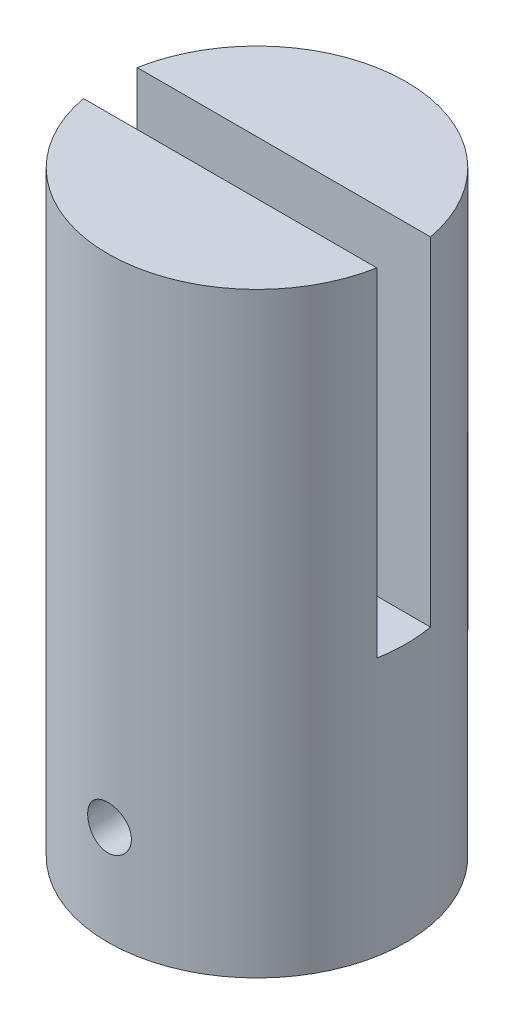
ISO-10303-21;
HEADER;
FILE_DESCRIPTION(('STEP AP214'),'2;1');
FILE_NAME('part.step','',(''),(''),'','','');
FILE_SCHEMA(('AUTOMOTIVE_DESIGN { 1 0 10303 214 1 1 1 1 }'));
ENDSEC;
DATA;
#1=APPLICATION_CONTEXT('core data for automotive mechanical design processes');
#2=APPLICATION_PROTOCOL_DEFINITION('international standard','automotive_design',2000,#1);
#3=PRODUCT_CONTEXT('',#1,'mechanical');
#4=PRODUCT('Part','Part','',(#3));
#5=PRODUCT_RELATED_PRODUCT_CATEGORY('part','',(#4));
#6=PRODUCT_DEFINITION_FORMATION('','',#4);
#7=PRODUCT_DEFINITION_CONTEXT('part definition',#1,'design');
#8=PRODUCT_DEFINITION('design','',#6,#7);
#9=PRODUCT_DEFINITION_SHAPE('','',#8);
#10=(LENGTH_UNIT() NAMED_UNIT(*) SI_UNIT(.MILLI.,.METRE.));
#11=(NAMED_UNIT(*) PLANE_ANGLE_UNIT() SI_UNIT($,.RADIAN.));
#12=(NAMED_UNIT(*) SI_UNIT($,.STERADIAN.) SOLID_ANGLE_UNIT());
#13=UNCERTAINTY_MEASURE_WITH_UNIT(LENGTH_MEASURE(1.E-05),#10,'distance_accuracy_value','');
#14=(GEOMETRIC_REPRESENTATION_CONTEXT(3) GLOBAL_UNCERTAINTY_ASSIGNED_CONTEXT((#13)) GLOBAL_UNIT_ASSIGNED_CONTEXT((#10,
#11,#12)) REPRESENTATION_CONTEXT('',''));
#15=CARTESIAN_POINT('',(0.,0.,0.));
#16=DIRECTION('',(0.,0.,1.));
#17=DIRECTION('',(1.,0.,0.));
#18=AXIS2_PLACEMENT_3D('',#15,#16,#17);
#19=CARTESIAN_POINT('',(0.,20.,0.));
#20=DIRECTION('',(0.,1.,0.));
#21=DIRECTION('',(0.,0.,1.));
#22=AXIS2_PLACEMENT_3D('',#19,#20,#21);
#23=PLANE('',#22);
#24=DIRECTION('',(-1.,0.,0.));
#25=VECTOR('',#24,1.);
#26=CARTESIAN_POINT('',(-7.37749957641476,20.,-1.35));
#27=LINE('',#26,#25);
#28=CARTESIAN_POINT('',(7.37749957641476,20.,-1.35));
#29=VERTEX_POINT('',#28);
#30=CARTESIAN_POINT('',(-7.37749957641476,20.,-1.35));
#31=VERTEX_POINT('',#30);
#32=EDGE_CURVE('E89',#29,#31,#27,.T.);
#33=ORIENTED_EDGE('',*,*,#32,.F.);
#34=CARTESIAN_POINT('',(0.,20.,0.));
#35=DIRECTION('',(0.,1.,0.));
#36=DIRECTION('',(0.,0.,1.));
#37=AXIS2_PLACEMENT_3D('',#34,#35,#36);
#38=CIRCLE('',#37,7.5);
#39=EDGE_CURVE('E138',#29,#31,#38,.T.);
#40=ORIENTED_EDGE('',*,*,#39,.T.);
#41=EDGE_LOOP('',(#33,#40));
#42=FACE_BOUND('',#41,.T.);
#43=ADVANCED_FACE('F45',(#42),#23,.T.);
#44=CARTESIAN_POINT('',(0.,-10.,0.));
#45=DIRECTION('',(0.,1.,0.));
#46=DIRECTION('',(0.,0.,1.));
#47=AXIS2_PLACEMENT_3D('',#44,#45,#46);
#48=CYLINDRICAL_SURFACE('',#47,3.075);
#49=CARTESIAN_POINT('',(0.,-6.1,3.075));
#50=CARTESIAN_POINT('',(0.0597632105915103,-6.10000126903366,3.07500091353291));
#51=CARTESIAN_POINT('',(0.119517399561416,-6.09511406328381,3.07324217731996));
#52=CARTESIAN_POINT('',(0.237250705765298,-6.07576514088002,3.06640085132919));
#53=CARTESIAN_POINT('',(0.295229896797585,-6.06130382285189,3.06131839993701));
#54=CARTESIAN_POINT('',(0.407698813293563,-6.02337630452029,3.04837809209227));
#55=CARTESIAN_POINT('',(0.462194682653862,-5.99992649989657,3.04052529103186));
#56=CARTESIAN_POINT('',(0.566477660621185,-5.94476710352712,3.02283460364577));
#57=CARTESIAN_POINT('',(0.616263632569546,-5.91305552483042,3.01299623992208));
#58=CARTESIAN_POINT('',(0.711663849973043,-5.84097210087029,2.99192770748854));
#59=CARTESIAN_POINT('',(0.757068682669079,-5.80033396928325,2.98066065730164));
#60=CARTESIAN_POINT('',(0.840583811243801,-5.71211652888779,2.95819499936736));
#61=CARTESIAN_POINT('',(0.878692156494227,-5.66453536991841,2.94699641069479));
#62=CARTESIAN_POINT('',(0.947805012054793,-5.56180563468115,2.92551666151353));
#63=CARTESIAN_POINT('',(0.978523865149615,-5.50645473717233,2.91527965187319));
#64=CARTESIAN_POINT('',(1.03012473348824,-5.39094751921219,2.89745041310426));
#65=CARTESIAN_POINT('',(1.05101027668641,-5.33079293128263,2.8898572356875));
#66=CARTESIAN_POINT('',(1.08154234180686,-5.20978565916813,2.878567116895));
#67=CARTESIAN_POINT('',(1.09158563194874,-5.14904628078243,2.87473313669863));
#68=CARTESIAN_POINT('',(1.10138880882361,-5.02663270008343,2.87099250068755));
#69=CARTESIAN_POINT('',(1.1011524661658,-4.96495884883633,2.871084404843));
#70=CARTESIAN_POINT('',(1.09070844073208,-4.84594781087021,2.87506616191202));
#71=CARTESIAN_POINT('',(1.08103664795686,-4.78855553580448,2.87875189613411));
#72=CARTESIAN_POINT('',(1.05287717520453,-4.67626991728994,2.8891690294204));
#73=CARTESIAN_POINT('',(1.03438828710002,-4.62137691742387,2.89590084585542));
#74=CARTESIAN_POINT('',(0.988801578974841,-4.5145028020138,2.91178396169409));
#75=CARTESIAN_POINT('',(0.961556446216323,-4.46259086855437,2.92097617627903));
#76=CARTESIAN_POINT('',(0.899333067466158,-4.36391425742879,2.94072922544267));
#77=CARTESIAN_POINT('',(0.864352328667182,-4.31715124630134,2.95129050074764));
#78=CARTESIAN_POINT('',(0.785146870237094,-4.22711362949867,2.9733747091378));
#79=CARTESIAN_POINT('',(0.740489838311403,-4.18422323085583,2.98491709623557));
#80=CARTESIAN_POINT('',(0.644479395867899,-4.10643180090674,3.00710762164267));
#81=CARTESIAN_POINT('',(0.593125134529764,-4.07153178625896,3.01775564604854));
#82=CARTESIAN_POINT('',(0.484269069333351,-4.01033831169734,3.03713676591382));
#83=CARTESIAN_POINT('',(0.426696323404617,-3.9841620482277,3.04584330297102));
#84=CARTESIAN_POINT('',(0.30757659733637,-3.94199049330725,3.06016548220972));
#85=CARTESIAN_POINT('',(0.246031227987589,-3.92599110362069,3.06578236847285));
#86=CARTESIAN_POINT('',(0.12395506428455,-3.90534116136183,3.07307904523022));
#87=CARTESIAN_POINT('',(0.0635225459169563,-3.90017250218114,3.07493841551141));
#88=CARTESIAN_POINT('',(-0.057367304900624,-3.89983610836605,3.07505850432261));
#89=CARTESIAN_POINT('',(-0.117824630045542,-3.90466638910093,3.07331993698611));
#90=CARTESIAN_POINT('',(-0.234879973270445,-3.92378955550845,3.06655818210888));
#91=CARTESIAN_POINT('',(-0.291539239123175,-3.93775222435941,3.06164969087323));
#92=CARTESIAN_POINT('',(-0.401678725134663,-3.97431845346469,3.04915621793125));
#93=CARTESIAN_POINT('',(-0.455158531401508,-3.99692313587518,3.04157088865021));
#94=CARTESIAN_POINT('',(-0.559110080706005,-4.05083152041721,3.02421524855408));
#95=CARTESIAN_POINT('',(-0.609454162925717,-4.08236293335769,3.01438926476075));
#96=CARTESIAN_POINT('',(-0.704297815473598,-4.15296833260514,2.99365165903803));
#97=CARTESIAN_POINT('',(-0.748795366698148,-4.19204491319558,2.98273966432851));
#98=CARTESIAN_POINT('',(-0.833129001356396,-4.27905847325215,2.96032524331328));
#99=CARTESIAN_POINT('',(-0.872596169193198,-4.32735370318518,2.94882198751349));
#100=CARTESIAN_POINT('',(-0.942927177236782,-4.4301186397681,2.92709283309226));
#101=CARTESIAN_POINT('',(-0.973790587222544,-4.48458865498954,2.9168669983609));
#102=CARTESIAN_POINT('',(-1.02598336827966,-4.59840309672575,2.89892221190103));
#103=CARTESIAN_POINT('',(-1.04730168264201,-4.657753082361,2.89120617024432));
#104=CARTESIAN_POINT('',(-1.07951998703451,-4.77954842780085,2.87933362937367));
#105=CARTESIAN_POINT('',(-1.09042564682632,-4.84199208357357,2.87517519314766));
#106=CARTESIAN_POINT('',(-1.10102820138284,-4.96424603481074,2.87113060305105));
#107=CARTESIAN_POINT('',(-1.10134688325625,-5.02399507849706,2.87100745743974));
#108=CARTESIAN_POINT('',(-1.0923327896614,-5.14264673120247,2.87444896417784));
#109=CARTESIAN_POINT('',(-1.0830007699531,-5.20154940613566,2.87801332775324));
#110=CARTESIAN_POINT('',(-1.05541669369935,-5.31533826321456,2.88823945176782));
#111=CARTESIAN_POINT('',(-1.03739576690336,-5.37028830201472,2.89482074820406));
#112=CARTESIAN_POINT('',(-0.993141438349157,-5.47642219102966,2.91029929004741));
#113=CARTESIAN_POINT('',(-0.966906056978599,-5.52760512972992,2.91919709362548));
#114=CARTESIAN_POINT('',(-0.905476589495095,-5.62746674944541,2.93884740010209));
#115=CARTESIAN_POINT('',(-0.869907463822172,-5.67590094331998,2.94966927402328));
#116=CARTESIAN_POINT('',(-0.791423139928681,-5.7663128501915,2.97168873102052));
#117=CARTESIAN_POINT('',(-0.748505716699851,-5.80828860029058,2.98288642706456));
#118=CARTESIAN_POINT('',(-0.654105696965442,-5.88661231238092,3.00503356644749));
#119=CARTESIAN_POINT('',(-0.602313455460042,-5.92259903481401,3.01594606048935));
#120=CARTESIAN_POINT('',(-0.493040357482252,-5.98533178801608,3.03572313281877));
#121=CARTESIAN_POINT('',(-0.435559904846423,-6.01207847418007,3.04458785633974));
#122=CARTESIAN_POINT('',(-0.316169446179156,-6.05550540038379,3.05929640196948));
#123=CARTESIAN_POINT('',(-0.254237056994954,-6.07213012163186,3.06512353833066));
#124=CARTESIAN_POINT('',(-0.12819907635475,-6.09437457645116,3.07297409935994));
#125=CARTESIAN_POINT('',(-0.0640943498632311,-6.09999863899736,3.07499902026184));
#126=CARTESIAN_POINT('',(0.,-6.1,3.075));
#127=B_SPLINE_CURVE_WITH_KNOTS('',3,(#49,#50,#51,#52,#53,#54,#55,#56,#57,#58,#59,#60,#61,#62,
#63,#64,#65,#66,#67,#68,#69,#70,#71,#72,#73,#74,#75,#76,#77,#78,#79,#80,#81,#82,#83,#84,#85,#86,
#87,#88,#89,#90,#91,#92,#93,#94,#95,#96,#97,#98,#99,#100,#101,#102,#103,#104,#105,#106,#107,
#108,#109,#110,#111,#112,#113,#114,#115,#116,#117,#118,#119,#120,#121,#122,#123,#124,#125,#126),
.UNSPECIFIED.,.T.,.F.,(4,2,2,2,2,2,2,2,2,2,2,2,2,2,2,2,2,2,2,2,2,2,2,2,2,2,2,2,2,2,2,2,2,2,2,2,
2,2,4),(0.,0.179053444377991,0.358099434191551,0.536820372911771,0.715584333636371,
0.900661290192836,1.08578765597631,1.2772097231424,1.4685630602557,1.65264806059341,
1.83666553840804,2.01080592567889,2.18497018070212,2.36223306486509,2.53955315564051,
2.72763972864487,2.91575021960748,3.1062945407004,3.29676208077231,3.47788837373556,
3.65897871945424,3.8338582821191,4.00876056042409,4.1886039094213,4.36850920510472,
4.5578892302861,4.74727872349995,4.93688703495576,5.12639204441126,5.30474619044246,
5.48308637036819,5.6569244278466,5.83080441107637,6.01317878259815,6.19560847365733,
6.38668861626958,6.57775520279875,6.76986056054624,6.96189030584593),.UNSPECIFIED.);
#128=CARTESIAN_POINT('',(0.,-6.1,3.075));
#129=VERTEX_POINT('',#128);
#130=EDGE_CURVE('E126',#129,#129,#127,.T.);
#131=ORIENTED_EDGE('',*,*,#130,.T.);
#132=EDGE_LOOP('',(#131));
#133=FACE_BOUND('',#132,.T.);
#134=CARTESIAN_POINT('',(1.1,-5.,-2.87151963252909));
#135=CARTESIAN_POINT('',(1.10000131770952,-5.05962473591265,-2.87151847603148));
#136=CARTESIAN_POINT('',(1.09513587171653,-5.11924037385219,-2.87339695257202));
#137=CARTESIAN_POINT('',(1.07588126258539,-5.23668743152562,-2.88066114770109));
#138=CARTESIAN_POINT('',(1.06149165475282,-5.29451876781637,-2.88604703005436));
#139=CARTESIAN_POINT('',(1.02377347157126,-5.40667261861835,-2.8996395647741));
#140=CARTESIAN_POINT('',(1.0004646105976,-5.46100256504228,-2.90783999201393));
#141=CARTESIAN_POINT('',(0.945638446192896,-5.56500079435962,-2.92612803084244));
#142=CARTESIAN_POINT('',(0.914118933557319,-5.61466781772006,-2.93621615013819));
#143=CARTESIAN_POINT('',(0.842241837186764,-5.71017277545947,-2.95765344908462));
#144=CARTESIAN_POINT('',(0.801574691309067,-5.75576999241448,-2.9690373869454));
#145=CARTESIAN_POINT('',(0.713215169595768,-5.83966464354244,-2.99149209259413));
#146=CARTESIAN_POINT('',(0.665521465240456,-5.87796069412716,-3.00256280068648));
#147=CARTESIAN_POINT('',(0.562664173505737,-5.94729638437402,-3.02355222150997));
#148=CARTESIAN_POINT('',(0.507316803581348,-5.97807840867971,-3.03342537222178));
#149=CARTESIAN_POINT('',(0.391814508446919,-6.02979680802113,-3.0504930105959));
#150=CARTESIAN_POINT('',(0.331661096752453,-6.05073626848381,-3.05768833754947));
#151=CARTESIAN_POINT('',(0.210782115719207,-6.08134293003399,-3.06834311930066));
#152=CARTESIAN_POINT('',(0.150173530849659,-6.09142367049775,-3.0719392293443));
#153=CARTESIAN_POINT('',(0.0280254221603174,-6.10134743808663,-3.07547853225752));
#154=CARTESIAN_POINT('',(-0.0335138206119407,-6.10119349658941,-3.07542280675266));
#155=CARTESIAN_POINT('',(-0.152828211010988,-6.09090231663337,-3.07175408845823));
#156=CARTESIAN_POINT('',(-0.210647976928136,-6.08121547544147,-3.06830158384997));
#157=CARTESIAN_POINT('',(-0.3237793704866,-6.05288560240764,-3.058433877302));
#158=CARTESIAN_POINT('',(-0.379090822602802,-6.03424194484671,-3.05201846837639));
#159=CARTESIAN_POINT('',(-0.486553864673533,-5.98829605753622,-3.03675480109506));
#160=CARTESIAN_POINT('',(-0.538650177183935,-5.96087591941742,-3.02787364541843));
#161=CARTESIAN_POINT('',(-0.63762647978217,-5.89825646632391,-3.00858833398922));
#162=CARTESIAN_POINT('',(-0.684504870544227,-5.86305477607249,-2.99818371353537));
#163=CARTESIAN_POINT('',(-0.774380644087464,-5.78365795480602,-2.97627517965288));
#164=CARTESIAN_POINT('',(-0.817034562949113,-5.73908146219389,-2.96474223763091));
#165=CARTESIAN_POINT('',(-0.894383288063324,-5.64332547483675,-2.94233393768585));
#166=CARTESIAN_POINT('',(-0.929076449387705,-5.59214461884198,-2.93145871600852));
#167=CARTESIAN_POINT('',(-0.990095217710666,-5.48339308654567,-2.9114241863929));
#168=CARTESIAN_POINT('',(-1.01625323196948,-5.4257212875831,-2.90230054669491));
#169=CARTESIAN_POINT('',(-1.0583617387087,-5.30638029550772,-2.88721348582824));
#170=CARTESIAN_POINT('',(-1.07431730107417,-5.24471310462283,-2.8812484952917));
#171=CARTESIAN_POINT('',(-1.09482203330999,-5.1224993785686,-2.87351777180381));
#172=CARTESIAN_POINT('',(-1.09991145357729,-5.06205609943027,-2.87155338255037));
#173=CARTESIAN_POINT('',(-1.10008619536482,-4.94116033372241,-2.87148678309557));
#174=CARTESIAN_POINT('',(-1.09517370711197,-4.88070785206672,-2.87338372733591));
#175=CARTESIAN_POINT('',(-1.07597222321109,-4.7641423008621,-2.88062582510613));
#176=CARTESIAN_POINT('',(-1.06208221203039,-4.70795335818176,-2.88582409542701));
#177=CARTESIAN_POINT('',(-1.02581193388852,-4.59872273766569,-2.89891427709482));
#178=CARTESIAN_POINT('',(-1.00343002420717,-4.54568167106988,-2.90680670958585));
#179=CARTESIAN_POINT('',(-0.949921615532453,-4.44218124836985,-2.92473837725696));
#180=CARTESIAN_POINT('',(-0.918515276120809,-4.39187827972181,-2.93484334823574));
#181=CARTESIAN_POINT('',(-0.848155327810068,-4.2970629959327,-2.95594394853883));
#182=CARTESIAN_POINT('',(-0.809199178822545,-4.25255263812917,-2.96693987689384));
#183=CARTESIAN_POINT('',(-0.722226212551702,-4.16797045341023,-2.98933765026307));
#184=CARTESIAN_POINT('',(-0.673820739140554,-4.12829370589489,-3.00072713177972));
#185=CARTESIAN_POINT('',(-0.57075763029431,-4.05758813852833,-3.02202345931754));
#186=CARTESIAN_POINT('',(-0.516100095849029,-4.02655917901682,-3.03193032928144));
#187=CARTESIAN_POINT('',(-0.402236510192129,-3.97427649622796,-3.04911875808664));
#188=CARTESIAN_POINT('',(-0.343054986122285,-3.95297389666075,-3.05641340287457));
#189=CARTESIAN_POINT('',(-0.221631678370066,-3.92073144496485,-3.06760725170602));
#190=CARTESIAN_POINT('',(-0.159391199819758,-3.90978721302949,-3.07150789077346));
#191=CARTESIAN_POINT('',(-0.0372049795385518,-3.89901194158228,-3.07534991733188));
#192=CARTESIAN_POINT('',(0.0226852322039303,-3.89861732856655,-3.07549208231335));
#193=CARTESIAN_POINT('',(0.14163978922418,-3.90752823517031,-3.07231218324376));
#194=CARTESIAN_POINT('',(0.200704218830169,-3.9168327568804,-3.06899047557822));
#195=CARTESIAN_POINT('',(0.315105959897884,-3.9444897847861,-3.0593405455396));
#196=CARTESIAN_POINT('',(0.370494945156223,-3.96265224709085,-3.05307556929679));
#197=CARTESIAN_POINT('',(0.47745185103428,-4.00732651373115,-3.03818753718342));
#198=CARTESIAN_POINT('',(0.529019053034509,-4.03383988341319,-3.02956403925667));
#199=CARTESIAN_POINT('',(0.629129975130921,-4.09567990977488,-3.01040243315964));
#200=CARTESIAN_POINT('',(0.677469404553846,-4.13131746547319,-2.99980139384808));
#201=CARTESIAN_POINT('',(0.767660743359063,-4.20988813583839,-2.97799910953856));
#202=CARTESIAN_POINT('',(0.809510422680756,-4.25282374774608,-2.96679765999418));
#203=CARTESIAN_POINT('',(0.887543971684473,-4.34717121489927,-2.94442133989725));
#204=CARTESIAN_POINT('',(0.923370180238827,-4.3988861094655,-2.93327234143168));
#205=CARTESIAN_POINT('',(0.985819487120141,-4.50795570701007,-2.91287979595815));
#206=CARTESIAN_POINT('',(1.01244315852089,-4.56531005851413,-2.903636130313));
#207=CARTESIAN_POINT('',(1.05567935909929,-4.68444375442762,-2.88820030754541));
#208=CARTESIAN_POINT('',(1.07223714115202,-4.74624528830966,-2.88202487076171));
#209=CARTESIAN_POINT('',(1.09439397978158,-4.87203545589418,-2.87368616962434));
#210=CARTESIAN_POINT('',(1.09999858610446,-4.93602296527697,-2.87152087344507));
#211=CARTESIAN_POINT('',(1.1,-5.,-2.87151963252909));
#212=B_SPLINE_CURVE_WITH_KNOTS('',3,(#134,#135,#136,#137,#138,#139,#140,#141,#142,#143,#144,
#145,#146,#147,#148,#149,#150,#151,#152,#153,#154,#155,#156,#157,#158,#159,#160,#161,#162,#163,
#164,#165,#166,#167,#168,#169,#170,#171,#172,#173,#174,#175,#176,#177,#178,#179,#180,#181,#182,
#183,#184,#185,#186,#187,#188,#189,#190,#191,#192,#193,#194,#195,#196,#197,#198,#199,#200,#201,
#202,#203,#204,#205,#206,#207,#208,#209,#210,#211),.UNSPECIFIED.,.T.,.F.,(4,2,2,2,2,2,2,2,2,2,2,
2,2,2,2,2,2,2,2,2,2,2,2,2,2,2,2,2,2,2,2,2,2,2,2,2,2,2,4),(0.,0.178636531943315,
0.357281405226638,0.535533676500885,0.713833958971606,0.899449843639194,1.08510086806723,
1.27642721068814,1.46769353665049,1.65138582892187,1.83502371420413,2.01038251663651,
2.18575357133458,2.36358720391529,2.5414751943917,2.72891319682236,2.91638989468673,
3.10735276198973,3.29822066057895,3.47935381233509,3.66044730365699,3.83399952556349,
4.00758533751092,4.18727563091088,4.36702648532121,4.55697525307953,4.74692095302029,
4.93590135060676,5.1248018062672,5.30358957341811,5.48235894754814,5.65745122757812,
5.83257634755562,6.01472712708489,6.19694036070302,6.38769714709019,6.57844205225207,
6.77021532425795,6.96189140352281),.UNSPECIFIED.);
#213=CARTESIAN_POINT('',(1.1,-5.,-2.87151963252909));
#214=VERTEX_POINT('',#213);
#215=EDGE_CURVE('E169',#214,#214,#212,.T.);
#216=ORIENTED_EDGE('',*,*,#215,.T.);
#217=EDGE_LOOP('',(#216));
#218=FACE_BOUND('',#217,.T.);
#219=CARTESIAN_POINT('',(0.,-10.,0.));
#220=DIRECTION('',(0.,1.,0.));
#221=DIRECTION('',(0.,0.,1.));
#222=AXIS2_PLACEMENT_3D('',#219,#220,#221);
#223=CIRCLE('',#222,3.075);
#224=CARTESIAN_POINT('',(0.,-10.,3.075));
#225=VERTEX_POINT('',#224);
#226=EDGE_CURVE('E139',#225,#225,#223,.T.);
#227=ORIENTED_EDGE('',*,*,#226,.F.);
#228=EDGE_LOOP('',(#227));
#229=FACE_BOUND('',#228,.T.);
#230=CARTESIAN_POINT('',(0.,0.,0.));
#231=DIRECTION('',(0.,1.,0.));
#232=DIRECTION('',(0.,0.,1.));
#233=AXIS2_PLACEMENT_3D('',#230,#231,#232);
#234=CIRCLE('',#233,3.075);
#235=CARTESIAN_POINT('',(0.,0.,3.075));
#236=VERTEX_POINT('',#235);
#237=EDGE_CURVE('E144',#236,#236,#234,.T.);
#238=ORIENTED_EDGE('',*,*,#237,.T.);
#239=EDGE_LOOP('',(#238));
#240=FACE_BOUND('',#239,.T.);
#241=ADVANCED_FACE('F47',(#133,#218,#229,#240),#48,.F.);
#242=CARTESIAN_POINT('',(0.,-10.,0.));
#243=DIRECTION('',(0.,1.,0.));
#244=DIRECTION('',(0.,0.,1.));
#245=AXIS2_PLACEMENT_3D('',#242,#243,#244);
#246=CYLINDRICAL_SURFACE('',#245,7.5);
#247=CARTESIAN_POINT('',(0.,-3.9,-7.5));
#248=CARTESIAN_POINT('',(0.0614339137792254,-3.90000254549349,-7.49999903078676));
#249=CARTESIAN_POINT('',(0.122903869751573,-3.90516390668222,-7.49923725541577));
#250=CARTESIAN_POINT('',(0.244126707027792,-3.92566838042423,-7.49627169143623));
#251=CARTESIAN_POINT('',(0.303877838643947,-3.94102150996431,-7.49406648417941));
#252=CARTESIAN_POINT('',(0.419891057921686,-3.98144182653872,-7.48846196014082));
#253=CARTESIAN_POINT('',(0.476155705499526,-4.00650178600017,-7.48506353199072));
#254=CARTESIAN_POINT('',(0.583672318702268,-4.06560699327752,-7.47744844153889));
#255=CARTESIAN_POINT('',(0.63492500236734,-4.09965095140642,-7.47323189670389));
#256=CARTESIAN_POINT('',(0.731355183041635,-4.17602929289263,-7.46441445772028));
#257=CARTESIAN_POINT('',(0.776489749189182,-4.21841760855832,-7.45981118128225));
#258=CARTESIAN_POINT('',(0.859032180642691,-4.31016538152651,-7.45075782263986));
#259=CARTESIAN_POINT('',(0.8964396091892,-4.35952523261435,-7.4463077491068));
#260=CARTESIAN_POINT('',(0.962632049862312,-4.46410210237275,-7.43804150204043));
#261=CARTESIAN_POINT('',(0.991375704507371,-4.51934556285402,-7.43422840657554));
#262=CARTESIAN_POINT('',(1.03916040032448,-4.6339413056616,-7.4277002412086));
#263=CARTESIAN_POINT('',(1.05820194689178,-4.69329337378228,-7.42498511411349));
#264=CARTESIAN_POINT('',(1.08590896566669,-4.81397080126806,-7.42098364429715));
#265=CARTESIAN_POINT('',(1.09464780616288,-4.87527897467988,-7.41968720355019));
#266=CARTESIAN_POINT('',(1.10172860035277,-4.99850422396054,-7.4186392078154));
#267=CARTESIAN_POINT('',(1.10007112514448,-5.060421266196,-7.41888756796745));
#268=CARTESIAN_POINT('',(1.08646633340055,-5.18258938077591,-7.42089187683157));
#269=CARTESIAN_POINT('',(1.074600601277,-5.24284976276574,-7.42263587207579));
#270=CARTESIAN_POINT('',(1.0410437721177,-5.36051487436565,-7.42741627905539));
#271=CARTESIAN_POINT('',(1.01935240833592,-5.41791952640148,-7.43045272587809));
#272=CARTESIAN_POINT('',(0.9666747959219,-5.52849264509925,-7.43748916017096));
#273=CARTESIAN_POINT('',(0.935653862230755,-5.58164435018106,-7.44149273205095));
#274=CARTESIAN_POINT('',(0.865222397580546,-5.68201885530944,-7.45000970051316));
#275=CARTESIAN_POINT('',(0.825811339856102,-5.72924128279628,-7.45452312909787));
#276=CARTESIAN_POINT('',(0.739269913176589,-5.81688969773502,-7.46360412460752));
#277=CARTESIAN_POINT('',(0.692069374554426,-5.85724642305706,-7.468171796712));
#278=CARTESIAN_POINT('',(0.59152834177619,-5.92947596797951,-7.47680652057131));
#279=CARTESIAN_POINT('',(0.538187822827545,-5.96134875332097,-7.48087357030453));
#280=CARTESIAN_POINT('',(0.426821886355061,-6.01570872231936,-7.48805278591713));
#281=CARTESIAN_POINT('',(0.368793894772149,-6.03819070676104,-7.49116442258036));
#282=CARTESIAN_POINT('',(0.249730300005073,-6.07307143246982,-7.49607774605898));
#283=CARTESIAN_POINT('',(0.18869489140167,-6.08547082517737,-7.49787951750451));
#284=CARTESIAN_POINT('',(0.0659469706202572,-6.09974262923242,-7.49995892171531));
#285=CARTESIAN_POINT('',(0.0042457578093759,-6.10171028893742,-7.50025034437375));
#286=CARTESIAN_POINT('',(-0.118605719627989,-6.09531538208784,-7.49931370926277));
#287=CARTESIAN_POINT('',(-0.179756000485778,-6.08695312087777,-7.4980856964067));
#288=CARTESIAN_POINT('',(-0.299482343134792,-6.06021494109972,-7.49425670440967));
#289=CARTESIAN_POINT('',(-0.358068956985494,-6.0418852853352,-7.49166207005829));
#290=CARTESIAN_POINT('',(-0.471337351522008,-5.99578131532552,-7.4853898820589));
#291=CARTESIAN_POINT('',(-0.526018955716097,-5.96800657452457,-7.48171227950325));
#292=CARTESIAN_POINT('',(-0.630344895974966,-5.90357639841735,-7.47364872669928));
#293=CARTESIAN_POINT('',(-0.679951436879122,-5.86686037164079,-7.4692580146524));
#294=CARTESIAN_POINT('',(-0.772332556824691,-5.78567440913556,-7.46027215892464));
#295=CARTESIAN_POINT('',(-0.815106756906359,-5.74120404359393,-7.45567700392226));
#296=CARTESIAN_POINT('',(-0.89295433674454,-5.64534834716264,-7.44675660483446));
#297=CARTESIAN_POINT('',(-0.927963966645664,-5.59391098267122,-7.44243378980161));
#298=CARTESIAN_POINT('',(-0.988845883817523,-5.48582972563999,-7.43459010616074));
#299=CARTESIAN_POINT('',(-1.01471840934016,-5.42918596890649,-7.43106921664319));
#300=CARTESIAN_POINT('',(-1.05649225011172,-5.31249216275356,-7.42524548075169));
#301=CARTESIAN_POINT('',(-1.07242745544987,-5.25245446070129,-7.42293849873847));
#302=CARTESIAN_POINT('',(-1.09398237497283,-5.13051870640119,-7.41979266689479));
#303=CARTESIAN_POINT('',(-1.09960276755589,-5.06862077677145,-7.41895372051277));
#304=CARTESIAN_POINT('',(-1.10035290779075,-4.94535684661601,-7.41884244449659));
#305=CARTESIAN_POINT('',(-1.0955828767175,-4.88399144592204,-7.4195551483194));
#306=CARTESIAN_POINT('',(-1.07590197796449,-4.76294549188111,-7.42243439260507));
#307=CARTESIAN_POINT('',(-1.06099112373807,-4.70326493629907,-7.42460093113919));
#308=CARTESIAN_POINT('',(-1.02148671040963,-4.58730848428274,-7.43013858440607));
#309=CARTESIAN_POINT('',(-0.996899848024538,-4.53103026411966,-7.43350886588553));
#310=CARTESIAN_POINT('',(-0.938751285001512,-4.42338153240762,-7.44107531977226));
#311=CARTESIAN_POINT('',(-0.905189307493384,-4.37201117232589,-7.44527151765687));
#312=CARTESIAN_POINT('',(-0.829677941083677,-4.27512669624521,-7.45406523526029));
#313=CARTESIAN_POINT('',(-0.787654244466669,-4.22967079186304,-7.45866609131538));
#314=CARTESIAN_POINT('',(-0.696569291934378,-4.14642019159302,-7.46772263777699));
#315=CARTESIAN_POINT('',(-0.647506399685664,-4.10862728199045,-7.47217829413399));
#316=CARTESIAN_POINT('',(-0.543433518566299,-4.0415991568414,-7.4804690354185));
#317=CARTESIAN_POINT('',(-0.488393657059063,-4.012409915266,-7.48430073920828));
#318=CARTESIAN_POINT('',(-0.37416307280373,-3.96373339505319,-7.49087858915199));
#319=CARTESIAN_POINT('',(-0.314976753586265,-3.94423599668696,-7.49362586698822));
#320=CARTESIAN_POINT('',(-0.212932358081482,-3.91995514332138,-7.49709312323017));
#321=CARTESIAN_POINT('',(-0.170706280118833,-3.9124833013654,-7.49817764536712));
#322=CARTESIAN_POINT('',(-0.0856593052075394,-3.90250487105526,-7.4996314175168));
#323=CARTESIAN_POINT('',(-0.0428384151765292,-3.89999822500472,-7.50000067584102));
#324=CARTESIAN_POINT('',(0.,-3.9,-7.5));
#325=B_SPLINE_CURVE_WITH_KNOTS('',3,(#247,#248,#249,#250,#251,#252,#253,#254,#255,#256,#257,
#258,#259,#260,#261,#262,#263,#264,#265,#266,#267,#268,#269,#270,#271,#272,#273,#274,#275,#276,
#277,#278,#279,#280,#281,#282,#283,#284,#285,#286,#287,#288,#289,#290,#291,#292,#293,#294,#295,
#296,#297,#298,#299,#300,#301,#302,#303,#304,#305,#306,#307,#308,#309,#310,#311,#312,#313,#314,
#315,#316,#317,#318,#319,#320,#321,#322,#323,#324),.UNSPECIFIED.,.T.,.F.,(4,2,2,2,2,2,2,2,2,2,2,
2,2,2,2,2,2,2,2,2,2,2,2,2,2,2,2,2,2,2,2,2,2,2,2,2,2,2,4),(0.,0.184145214135645,
0.368471684025478,0.552661169958333,0.736824229163183,0.922219175599117,1.10762459821091,
1.29390154601941,1.48016878943053,1.66510140488703,1.85002386157894,2.03348200306703,
2.21694512537133,2.40109893203312,2.58526430401544,2.77118963521338,2.95711571718387,
3.14314460109183,3.32916146464068,3.51347691345021,3.69778691416735,3.88124866815049,
4.0647187086728,4.24946845023511,4.4342284354933,4.62045340203654,4.80667351236636,
4.99225501652602,5.17782431467818,5.36161162819954,5.54539869789972,5.72905879255057,
5.91272455352131,6.09807966640001,6.28347793700445,6.46984963984061,6.65602633191713,
6.78443392176047,6.91284001947813),.UNSPECIFIED.);
#326=CARTESIAN_POINT('',(0.,-3.9,-7.5));
#327=VERTEX_POINT('',#326);
#328=EDGE_CURVE('E11',#327,#327,#325,.T.);
#329=ORIENTED_EDGE('',*,*,#328,.F.);
#330=EDGE_LOOP('',(#329));
#331=FACE_BOUND('',#330,.T.);
#332=CARTESIAN_POINT('',(0.,-6.1,7.5));
#333=CARTESIAN_POINT('',(0.0614339137792254,-6.09999745450651,7.49999903078676));
#334=CARTESIAN_POINT('',(0.122903869751573,-6.09483609331779,7.49923725541577));
#335=CARTESIAN_POINT('',(0.244126707027792,-6.07433161957577,7.49627169143623));
#336=CARTESIAN_POINT('',(0.303877838643947,-6.05897849003569,7.49406648417941));
#337=CARTESIAN_POINT('',(0.419891057921686,-6.01855817346128,7.48846196014082));
#338=CARTESIAN_POINT('',(0.476155705499526,-5.99349821399983,7.48506353199072));
#339=CARTESIAN_POINT('',(0.583672318702268,-5.93439300672248,7.47744844153889));
#340=CARTESIAN_POINT('',(0.63492500236734,-5.90034904859358,7.47323189670389));
#341=CARTESIAN_POINT('',(0.731355183041635,-5.82397070710737,7.46441445772028));
#342=CARTESIAN_POINT('',(0.776489749189181,-5.78158239144168,7.45981118128225));
#343=CARTESIAN_POINT('',(0.85903218064269,-5.6898346184735,7.45075782263986));
#344=CARTESIAN_POINT('',(0.896439609189199,-5.64047476738565,7.4463077491068));
#345=CARTESIAN_POINT('',(0.962632049862312,-5.53589789762726,7.43804150204043));
#346=CARTESIAN_POINT('',(0.991375704507371,-5.48065443714598,7.43422840657554));
#347=CARTESIAN_POINT('',(1.03916040032448,-5.3660586943384,7.4277002412086));
#348=CARTESIAN_POINT('',(1.05820194689179,-5.30670662621772,7.42498511411349));
#349=CARTESIAN_POINT('',(1.08590896566669,-5.18602919873194,7.42098364429715));
#350=CARTESIAN_POINT('',(1.09464780616288,-5.12472102532012,7.41968720355019));
#351=CARTESIAN_POINT('',(1.10172860035277,-5.00149577603946,7.4186392078154));
#352=CARTESIAN_POINT('',(1.10007112514448,-4.939578733804,7.41888756796745));
#353=CARTESIAN_POINT('',(1.08646633340055,-4.81741061922409,7.42089187683157));
#354=CARTESIAN_POINT('',(1.074600601277,-4.75715023723427,7.42263587207579));
#355=CARTESIAN_POINT('',(1.0410437721177,-4.63948512563435,7.42741627905539));
#356=CARTESIAN_POINT('',(1.01935240833592,-4.58208047359852,7.43045272587809));
#357=CARTESIAN_POINT('',(0.9666747959219,-4.47150735490076,7.43748916017096));
#358=CARTESIAN_POINT('',(0.935653862230755,-4.41835564981894,7.44149273205095));
#359=CARTESIAN_POINT('',(0.865222397580546,-4.31798114469056,7.45000970051316));
#360=CARTESIAN_POINT('',(0.825811339856102,-4.27075871720372,7.45452312909787));
#361=CARTESIAN_POINT('',(0.739269913176589,-4.18311030226498,7.46360412460752));
#362=CARTESIAN_POINT('',(0.692069374554426,-4.14275357694294,7.468171796712));
#363=CARTESIAN_POINT('',(0.591528341776189,-4.07052403202049,7.47680652057131));
#364=CARTESIAN_POINT('',(0.538187822827545,-4.03865124667903,7.48087357030453));
#365=CARTESIAN_POINT('',(0.426821886355061,-3.98429127768064,7.48805278591713));
#366=CARTESIAN_POINT('',(0.368793894772149,-3.96180929323896,7.49116442258036));
#367=CARTESIAN_POINT('',(0.249730300005073,-3.92692856753019,7.49607774605898));
#368=CARTESIAN_POINT('',(0.18869489140167,-3.91452917482264,7.49787951750451));
#369=CARTESIAN_POINT('',(0.0659469706202573,-3.90025737076758,7.49995892171531));
#370=CARTESIAN_POINT('',(0.00424575780937592,-3.89828971106258,7.50025034437375));
#371=CARTESIAN_POINT('',(-0.118605719627989,-3.90468461791216,7.49931370926277));
#372=CARTESIAN_POINT('',(-0.179756000485778,-3.91304687912223,7.4980856964067));
#373=CARTESIAN_POINT('',(-0.299482343134793,-3.93978505890028,7.49425670440967));
#374=CARTESIAN_POINT('',(-0.358068956985494,-3.9581147146648,7.49166207005829));
#375=CARTESIAN_POINT('',(-0.471337351522008,-4.00421868467448,7.4853898820589));
#376=CARTESIAN_POINT('',(-0.526018955716097,-4.03199342547543,7.48171227950325));
#377=CARTESIAN_POINT('',(-0.630344895974966,-4.09642360158265,7.47364872669928));
#378=CARTESIAN_POINT('',(-0.679951436879122,-4.13313962835921,7.4692580146524));
#379=CARTESIAN_POINT('',(-0.772332556824691,-4.21432559086444,7.46027215892464));
#380=CARTESIAN_POINT('',(-0.815106756906359,-4.25879595640607,7.45567700392226));
#381=CARTESIAN_POINT('',(-0.89295433674454,-4.35465165283736,7.44675660483446));
#382=CARTESIAN_POINT('',(-0.927963966645664,-4.40608901732878,7.44243378980161));
#383=CARTESIAN_POINT('',(-0.988845883817523,-4.51417027436001,7.43459010616074));
#384=CARTESIAN_POINT('',(-1.01471840934016,-4.57081403109351,7.43106921664319));
#385=CARTESIAN_POINT('',(-1.05649225011172,-4.68750783724644,7.42524548075169));
#386=CARTESIAN_POINT('',(-1.07242745544987,-4.74754553929871,7.42293849873847));
#387=CARTESIAN_POINT('',(-1.09398237497283,-4.86948129359881,7.41979266689479));
#388=CARTESIAN_POINT('',(-1.09960276755589,-4.93137922322855,7.41895372051277));
#389=CARTESIAN_POINT('',(-1.10035290779075,-5.05464315338399,7.41884244449659));
#390=CARTESIAN_POINT('',(-1.0955828767175,-5.11600855407796,7.4195551483194));
#391=CARTESIAN_POINT('',(-1.07590197796449,-5.23705450811889,7.42243439260507));
#392=CARTESIAN_POINT('',(-1.06099112373807,-5.29673506370093,7.42460093113919));
#393=CARTESIAN_POINT('',(-1.02148671040963,-5.41269151571726,7.43013858440607));
#394=CARTESIAN_POINT('',(-0.996899848024538,-5.46896973588034,7.43350886588553));
#395=CARTESIAN_POINT('',(-0.938751285001512,-5.57661846759238,7.44107531977226));
#396=CARTESIAN_POINT('',(-0.905189307493384,-5.62798882767412,7.44527151765687));
#397=CARTESIAN_POINT('',(-0.829677941083677,-5.7248733037548,7.45406523526029));
#398=CARTESIAN_POINT('',(-0.787654244466668,-5.77032920813697,7.45866609131538));
#399=CARTESIAN_POINT('',(-0.696569291934377,-5.85357980840698,7.46772263777699));
#400=CARTESIAN_POINT('',(-0.647506399685664,-5.89137271800955,7.47217829413399));
#401=CARTESIAN_POINT('',(-0.543433518566299,-5.9584008431586,7.4804690354185));
#402=CARTESIAN_POINT('',(-0.488393657059064,-5.987590084734,7.48430073920828));
#403=CARTESIAN_POINT('',(-0.374163072803731,-6.03626660494681,7.49087858915199));
#404=CARTESIAN_POINT('',(-0.314976753586265,-6.05576400331304,7.49362586698822));
#405=CARTESIAN_POINT('',(-0.212932358081482,-6.08004485667862,7.49709312323017));
#406=CARTESIAN_POINT('',(-0.170706280118833,-6.0875166986346,7.49817764536712));
#407=CARTESIAN_POINT('',(-0.085659305207539,-6.09749512894474,7.4996314175168));
#408=CARTESIAN_POINT('',(-0.042838415176529,-6.10000177499528,7.50000067584102));
#409=CARTESIAN_POINT('',(0.,-6.1,7.5));
#410=B_SPLINE_CURVE_WITH_KNOTS('',3,(#332,#333,#334,#335,#336,#337,#338,#339,#340,#341,#342,
#343,#344,#345,#346,#347,#348,#349,#350,#351,#352,#353,#354,#355,#356,#357,#358,#359,#360,#361,
#362,#363,#364,#365,#366,#367,#368,#369,#370,#371,#372,#373,#374,#375,#376,#377,#378,#379,#380,
#381,#382,#383,#384,#385,#386,#387,#388,#389,#390,#391,#392,#393,#394,#395,#396,#397,#398,#399,
#400,#401,#402,#403,#404,#405,#406,#407,#408,#409),.UNSPECIFIED.,.T.,.F.,(4,2,2,2,2,2,2,2,2,2,2,
2,2,2,2,2,2,2,2,2,2,2,2,2,2,2,2,2,2,2,2,2,2,2,2,2,2,2,4),(0.,0.184145214135645,
0.368471684025478,0.552661169958333,0.736824229163183,0.922219175599117,1.10762459821091,
1.29390154601942,1.48016878943053,1.66510140488703,1.85002386157894,2.03348200306703,
2.21694512537133,2.40109893203312,2.58526430401544,2.77118963521338,2.95711571718387,
3.14314460109183,3.32916146464068,3.51347691345021,3.69778691416735,3.88124866815049,
4.0647187086728,4.24946845023511,4.4342284354933,4.62045340203654,4.80667351236636,
4.99225501652602,5.17782431467818,5.36161162819954,5.54539869789972,5.72905879255057,
5.91272455352131,6.09807966640001,6.28347793700445,6.46984963984061,6.65602633191713,
6.78443392176047,6.91284001947813),.UNSPECIFIED.);
#411=CARTESIAN_POINT('',(0.,-6.1,7.5));
#412=VERTEX_POINT('',#411);
#413=EDGE_CURVE('E59',#412,#412,#410,.T.);
#414=ORIENTED_EDGE('',*,*,#413,.F.);
#415=EDGE_LOOP('',(#414));
#416=FACE_BOUND('',#415,.T.);
#417=DIRECTION('',(0.,1.,0.));
#418=VECTOR('',#417,1.);
#419=CARTESIAN_POINT('',(-7.37749957641476,3.,-1.35));
#420=LINE('',#419,#418);
#421=CARTESIAN_POINT('',(-7.37749957641476,3.,-1.35));
#422=VERTEX_POINT('',#421);
#423=EDGE_CURVE('E75',#422,#31,#420,.T.);
#424=ORIENTED_EDGE('',*,*,#423,.T.);
#425=ORIENTED_EDGE('',*,*,#39,.F.);
#426=DIRECTION('',(0.,1.,0.));
#427=VECTOR('',#426,1.);
#428=CARTESIAN_POINT('',(7.37749957641476,3.,-1.35));
#429=LINE('',#428,#427);
#430=CARTESIAN_POINT('',(7.37749957641476,3.,-1.35));
#431=VERTEX_POINT('',#430);
#432=EDGE_CURVE('E104',#431,#29,#429,.T.);
#433=ORIENTED_EDGE('',*,*,#432,.F.);
#434=CARTESIAN_POINT('',(0.,3.,0.));
#435=DIRECTION('',(0.,1.,0.));
#436=DIRECTION('',(0.,0.,1.));
#437=AXIS2_PLACEMENT_3D('',#434,#435,#436);
#438=CIRCLE('',#437,7.5);
#439=CARTESIAN_POINT('',(7.37749957641476,3.,1.35));
#440=VERTEX_POINT('',#439);
#441=EDGE_CURVE('E108',#440,#431,#438,.T.);
#442=ORIENTED_EDGE('',*,*,#441,.F.);
#443=DIRECTION('',(0.,1.,0.));
#444=VECTOR('',#443,1.);
#445=CARTESIAN_POINT('',(7.37749957641476,3.,1.35));
#446=LINE('',#445,#444);
#447=CARTESIAN_POINT('',(7.37749957641476,20.,1.35));
#448=VERTEX_POINT('',#447);
#449=EDGE_CURVE('E96',#440,#448,#446,.T.);
#450=ORIENTED_EDGE('',*,*,#449,.T.);
#451=CARTESIAN_POINT('',(-7.37749957641476,20.,1.35));
#452=VERTEX_POINT('',#451);
#453=EDGE_CURVE('E131',#452,#448,#38,.T.);
#454=ORIENTED_EDGE('',*,*,#453,.F.);
#455=DIRECTION('',(0.,1.,0.));
#456=VECTOR('',#455,1.);
#457=CARTESIAN_POINT('',(-7.37749957641476,3.,1.35));
#458=LINE('',#457,#456);
#459=CARTESIAN_POINT('',(-7.37749957641476,3.,1.35));
#460=VERTEX_POINT('',#459);
#461=EDGE_CURVE('E66',#460,#452,#458,.T.);
#462=ORIENTED_EDGE('',*,*,#461,.F.);
#463=CARTESIAN_POINT('',(0.,3.,0.));
#464=DIRECTION('',(0.,1.,0.));
#465=DIRECTION('',(0.,0.,1.));
#466=AXIS2_PLACEMENT_3D('',#463,#464,#465);
#467=CIRCLE('',#466,7.5);
#468=EDGE_CURVE('E110',#422,#460,#467,.T.);
#469=ORIENTED_EDGE('',*,*,#468,.F.);
#470=EDGE_LOOP('',(#424,#425,#433,#442,#450,#454,#462,#469));
#471=FACE_BOUND('',#470,.T.);
#472=CARTESIAN_POINT('',(0.,-10.,0.));
#473=DIRECTION('',(0.,1.,0.));
#474=DIRECTION('',(0.,0.,1.));
#475=AXIS2_PLACEMENT_3D('',#472,#473,#474);
#476=CIRCLE('',#475,7.5);
#477=CARTESIAN_POINT('',(0.,-10.,7.5));
#478=VERTEX_POINT('',#477);
#479=EDGE_CURVE('E143',#478,#478,#476,.T.);
#480=ORIENTED_EDGE('',*,*,#479,.T.);
#481=EDGE_LOOP('',(#480));
#482=FACE_BOUND('',#481,.T.);
#483=ADVANCED_FACE('F114',(#331,#416,#471,#482),#246,.T.);
#484=CARTESIAN_POINT('',(0.,-10.,0.));
#485=DIRECTION('',(0.,1.,0.));
#486=DIRECTION('',(0.,0.,1.));
#487=AXIS2_PLACEMENT_3D('',#484,#485,#486);
#488=PLANE('',#487);
#489=ORIENTED_EDGE('',*,*,#226,.T.);
#490=EDGE_LOOP('',(#489));
#491=FACE_BOUND('',#490,.T.);
#492=ORIENTED_EDGE('',*,*,#479,.F.);
#493=EDGE_LOOP('',(#492));
#494=FACE_BOUND('',#493,.T.);
#495=ADVANCED_FACE('F195',(#491,#494),#488,.F.);
#496=CARTESIAN_POINT('',(0.,0.,0.));
#497=DIRECTION('',(0.,1.,0.));
#498=DIRECTION('',(0.,0.,1.));
#499=AXIS2_PLACEMENT_3D('',#496,#497,#498);
#500=PLANE('',#499);
#501=ORIENTED_EDGE('',*,*,#237,.F.);
#502=EDGE_LOOP('',(#501));
#503=FACE_BOUND('',#502,.T.);
#504=ADVANCED_FACE('F192',(#503),#500,.F.);
#505=DIRECTION('',(1.,0.,0.));
#506=VECTOR('',#505,1.);
#507=CARTESIAN_POINT('',(-7.37749957641476,20.,1.35));
#508=LINE('',#507,#506);
#509=EDGE_CURVE('E98',#452,#448,#508,.T.);
#510=ORIENTED_EDGE('',*,*,#509,.F.);
#511=ORIENTED_EDGE('',*,*,#453,.T.);
#512=EDGE_LOOP('',(#510,#511));
#513=FACE_BOUND('',#512,.T.);
#514=ADVANCED_FACE('F194',(#513),#23,.T.);
#515=CARTESIAN_POINT('',(-7.37749957641476,3.,-1.35));
#516=DIRECTION('',(0.,0.,-1.));
#517=DIRECTION('',(-1.,0.,0.));
#518=AXIS2_PLACEMENT_3D('',#515,#516,#517);
#519=PLANE('',#518);
#520=ORIENTED_EDGE('',*,*,#32,.T.);
#521=ORIENTED_EDGE('',*,*,#423,.F.);
#522=DIRECTION('',(-1.,0.,0.));
#523=VECTOR('',#522,1.);
#524=CARTESIAN_POINT('',(-7.37749957641476,3.,-1.35));
#525=LINE('',#524,#523);
#526=EDGE_CURVE('E118',#431,#422,#525,.T.);
#527=ORIENTED_EDGE('',*,*,#526,.F.);
#528=ORIENTED_EDGE('',*,*,#432,.T.);
#529=EDGE_LOOP('',(#520,#521,#527,#528));
#530=FACE_BOUND('',#529,.T.);
#531=ADVANCED_FACE('F201',(#530),#519,.F.);
#532=CARTESIAN_POINT('',(-7.37749957641476,3.,1.35));
#533=DIRECTION('',(0.,0.,1.));
#534=DIRECTION('',(1.,0.,0.));
#535=AXIS2_PLACEMENT_3D('',#532,#533,#534);
#536=PLANE('',#535);
#537=ORIENTED_EDGE('',*,*,#509,.T.);
#538=ORIENTED_EDGE('',*,*,#449,.F.);
#539=DIRECTION('',(1.,0.,0.));
#540=VECTOR('',#539,1.);
#541=CARTESIAN_POINT('',(-7.37749957641476,3.,1.35));
#542=LINE('',#541,#540);
#543=EDGE_CURVE('E93',#460,#440,#542,.T.);
#544=ORIENTED_EDGE('',*,*,#543,.F.);
#545=ORIENTED_EDGE('',*,*,#461,.T.);
#546=EDGE_LOOP('',(#537,#538,#544,#545));
#547=FACE_BOUND('',#546,.T.);
#548=ADVANCED_FACE('F97',(#547),#536,.F.);
#549=CARTESIAN_POINT('',(0.,3.,0.));
#550=DIRECTION('',(0.,1.,0.));
#551=DIRECTION('',(0.,0.,1.));
#552=AXIS2_PLACEMENT_3D('',#549,#550,#551);
#553=PLANE('',#552);
#554=ORIENTED_EDGE('',*,*,#468,.T.);
#555=ORIENTED_EDGE('',*,*,#543,.T.);
#556=ORIENTED_EDGE('',*,*,#441,.T.);
#557=ORIENTED_EDGE('',*,*,#526,.T.);
#558=EDGE_LOOP('',(#554,#555,#556,#557));
#559=FACE_BOUND('',#558,.T.);
#560=ADVANCED_FACE('F107',(#559),#553,.T.);
#561=CARTESIAN_POINT('',(0.,-5.,-7.5));
#562=DIRECTION('',(0.,0.,1.));
#563=DIRECTION('',(1.,0.,0.));
#564=AXIS2_PLACEMENT_3D('',#561,#562,#563);
#565=CYLINDRICAL_SURFACE('',#564,1.1);
#566=ORIENTED_EDGE('',*,*,#328,.T.);
#567=EDGE_LOOP('',(#566));
#568=FACE_BOUND('',#567,.T.);
#569=ORIENTED_EDGE('',*,*,#215,.F.);
#570=EDGE_LOOP('',(#569));
#571=FACE_BOUND('',#570,.T.);
#572=ADVANCED_FACE('F161',(#568,#571),#565,.F.);
#573=ORIENTED_EDGE('',*,*,#413,.T.);
#574=EDGE_LOOP('',(#573));
#575=FACE_BOUND('',#574,.T.);
#576=ORIENTED_EDGE('',*,*,#130,.F.);
#577=EDGE_LOOP('',(#576));
#578=FACE_BOUND('',#577,.T.);
#579=ADVANCED_FACE('F157',(#575,#578),#565,.F.);
#580=CLOSED_SHELL('',(#43,#241,#483,#495,#504,#514,#531,#548,#560,#572,#579));
#581=MANIFOLD_SOLID_BREP('B2',#580);
#582=ADVANCED_BREP_SHAPE_REPRESENTATION('',(#18,#581),#14);
#583=SHAPE_DEFINITION_REPRESENTATION(#9,#582);
ENDSEC;
END-ISO-10303-21;
